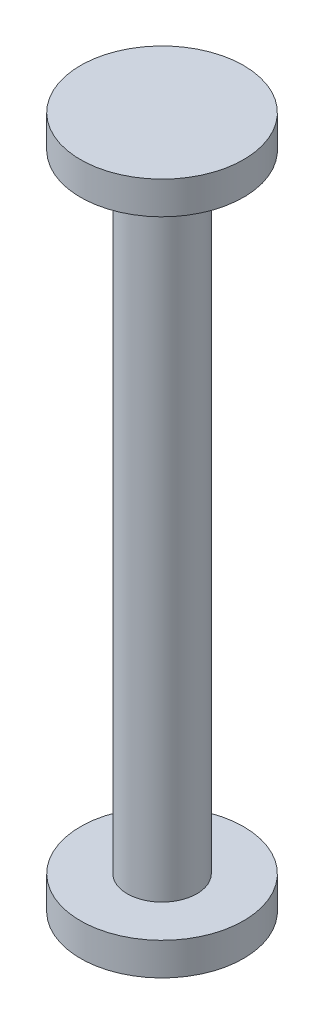
ISO-10303-21;
HEADER;
FILE_DESCRIPTION(('STEP AP214'),'2;1');
FILE_NAME('part.step','',(''),(''),'','','');
FILE_SCHEMA(('AUTOMOTIVE_DESIGN { 1 0 10303 214 1 1 1 1 }'));
ENDSEC;
DATA;
#1=APPLICATION_CONTEXT('core data for automotive mechanical design processes');
#2=APPLICATION_PROTOCOL_DEFINITION('international standard','automotive_design',2000,#1);
#3=PRODUCT_CONTEXT('',#1,'mechanical');
#4=PRODUCT('Part','Part','',(#3));
#5=PRODUCT_RELATED_PRODUCT_CATEGORY('part','',(#4));
#6=PRODUCT_DEFINITION_FORMATION('','',#4);
#7=PRODUCT_DEFINITION_CONTEXT('part definition',#1,'design');
#8=PRODUCT_DEFINITION('design','',#6,#7);
#9=PRODUCT_DEFINITION_SHAPE('','',#8);
#10=(LENGTH_UNIT() NAMED_UNIT(*) SI_UNIT(.MILLI.,.METRE.));
#11=(NAMED_UNIT(*) PLANE_ANGLE_UNIT() SI_UNIT($,.RADIAN.));
#12=(NAMED_UNIT(*) SI_UNIT($,.STERADIAN.) SOLID_ANGLE_UNIT());
#13=UNCERTAINTY_MEASURE_WITH_UNIT(LENGTH_MEASURE(1.E-05),#10,'distance_accuracy_value','');
#14=(GEOMETRIC_REPRESENTATION_CONTEXT(3) GLOBAL_UNCERTAINTY_ASSIGNED_CONTEXT((#13)) GLOBAL_UNIT_ASSIGNED_CONTEXT((#10,
#11,#12)) REPRESENTATION_CONTEXT('',''));
#15=CARTESIAN_POINT('',(0.,0.,0.));
#16=DIRECTION('',(0.,0.,1.));
#17=DIRECTION('',(1.,0.,0.));
#18=AXIS2_PLACEMENT_3D('',#15,#16,#17);
#19=CARTESIAN_POINT('',(0.,3.81,0.));
#20=DIRECTION('',(0.,-1.,0.));
#21=DIRECTION('',(0.,0.,-1.));
#22=AXIS2_PLACEMENT_3D('',#19,#20,#21);
#23=CYLINDRICAL_SURFACE('',#22,9.525);
#24=CARTESIAN_POINT('',(0.,3.81,0.));
#25=DIRECTION('',(0.,1.,0.));
#26=DIRECTION('',(0.,0.,1.));
#27=AXIS2_PLACEMENT_3D('',#24,#25,#26);
#28=CIRCLE('',#27,9.525);
#29=CARTESIAN_POINT('',(0.,3.81,-9.525));
#30=VERTEX_POINT('',#29);
#31=EDGE_CURVE('E46',#30,#30,#28,.T.);
#32=CARTESIAN_POINT('',(0.,0.,0.));
#33=DIRECTION('',(0.,1.,0.));
#34=DIRECTION('',(0.,0.,1.));
#35=AXIS2_PLACEMENT_3D('',#32,#33,#34);
#36=CIRCLE('',#35,9.525);
#37=CARTESIAN_POINT('',(0.,0.,-9.525));
#38=VERTEX_POINT('',#37);
#39=EDGE_CURVE('E45',#38,#38,#36,.T.);
#40=CARTESIAN_POINT('',(0.,3.81,-9.525));
#41=CARTESIAN_POINT('',(0.,3.7703125,-9.525));
#42=CARTESIAN_POINT('',(0.,3.730625,-9.525));
#43=CARTESIAN_POINT('',(0.,3.65125,-9.525));
#44=CARTESIAN_POINT('',(0.,3.6115625,-9.525));
#45=CARTESIAN_POINT('',(0.,3.5321875,-9.525));
#46=CARTESIAN_POINT('',(0.,3.4925,-9.525));
#47=CARTESIAN_POINT('',(0.,3.413125,-9.525));
#48=CARTESIAN_POINT('',(0.,3.3734375,-9.525));
#49=CARTESIAN_POINT('',(0.,3.2940625,-9.525));
#50=CARTESIAN_POINT('',(0.,3.254375,-9.525));
#51=CARTESIAN_POINT('',(0.,3.175,-9.525));
#52=CARTESIAN_POINT('',(0.,3.1353125,-9.525));
#53=CARTESIAN_POINT('',(0.,3.0559375,-9.525));
#54=CARTESIAN_POINT('',(0.,3.01625,-9.525));
#55=CARTESIAN_POINT('',(0.,2.936875,-9.525));
#56=CARTESIAN_POINT('',(0.,2.8971875,-9.525));
#57=CARTESIAN_POINT('',(0.,2.8178125,-9.525));
#58=CARTESIAN_POINT('',(0.,2.778125,-9.525));
#59=CARTESIAN_POINT('',(0.,2.69875,-9.525));
#60=CARTESIAN_POINT('',(0.,2.6590625,-9.525));
#61=CARTESIAN_POINT('',(0.,2.5796875,-9.525));
#62=CARTESIAN_POINT('',(0.,2.54,-9.525));
#63=CARTESIAN_POINT('',(0.,2.460625,-9.525));
#64=CARTESIAN_POINT('',(0.,2.4209375,-9.525));
#65=CARTESIAN_POINT('',(0.,2.3415625,-9.525));
#66=CARTESIAN_POINT('',(0.,2.301875,-9.525));
#67=CARTESIAN_POINT('',(0.,2.2225,-9.525));
#68=CARTESIAN_POINT('',(0.,2.1828125,-9.525));
#69=CARTESIAN_POINT('',(0.,2.1034375,-9.525));
#70=CARTESIAN_POINT('',(0.,2.06375,-9.525));
#71=CARTESIAN_POINT('',(0.,1.984375,-9.525));
#72=CARTESIAN_POINT('',(0.,1.9446875,-9.525));
#73=CARTESIAN_POINT('',(0.,1.8653125,-9.525));
#74=CARTESIAN_POINT('',(0.,1.825625,-9.525));
#75=CARTESIAN_POINT('',(0.,1.74625,-9.525));
#76=CARTESIAN_POINT('',(0.,1.7065625,-9.525));
#77=CARTESIAN_POINT('',(0.,1.6271875,-9.525));
#78=CARTESIAN_POINT('',(0.,1.5875,-9.525));
#79=CARTESIAN_POINT('',(0.,1.508125,-9.525));
#80=CARTESIAN_POINT('',(0.,1.4684375,-9.525));
#81=CARTESIAN_POINT('',(0.,1.3890625,-9.525));
#82=CARTESIAN_POINT('',(0.,1.349375,-9.525));
#83=CARTESIAN_POINT('',(0.,1.27,-9.525));
#84=CARTESIAN_POINT('',(0.,1.2303125,-9.525));
#85=CARTESIAN_POINT('',(0.,1.1509375,-9.525));
#86=CARTESIAN_POINT('',(0.,1.11125,-9.525));
#87=CARTESIAN_POINT('',(0.,1.031875,-9.525));
#88=CARTESIAN_POINT('',(0.,0.9921875,-9.525));
#89=CARTESIAN_POINT('',(0.,0.9128125,-9.525));
#90=CARTESIAN_POINT('',(0.,0.873125,-9.525));
#91=CARTESIAN_POINT('',(0.,0.79375,-9.525));
#92=CARTESIAN_POINT('',(0.,0.7540625,-9.525));
#93=CARTESIAN_POINT('',(0.,0.6746875,-9.525));
#94=CARTESIAN_POINT('',(0.,0.635,-9.525));
#95=CARTESIAN_POINT('',(0.,0.555625,-9.525));
#96=CARTESIAN_POINT('',(0.,0.5159375,-9.525));
#97=CARTESIAN_POINT('',(0.,0.4365625,-9.525));
#98=CARTESIAN_POINT('',(0.,0.396875,-9.525));
#99=CARTESIAN_POINT('',(0.,0.3175,-9.525));
#100=CARTESIAN_POINT('',(0.,0.2778125,-9.525));
#101=CARTESIAN_POINT('',(0.,0.1984375,-9.525));
#102=CARTESIAN_POINT('',(0.,0.15875,-9.525));
#103=CARTESIAN_POINT('',(0.,0.0793749999999999,-9.525));
#104=CARTESIAN_POINT('',(0.,0.0396874999999999,-9.525));
#105=CARTESIAN_POINT('',(0.,0.,-9.525));
#106=B_SPLINE_CURVE_WITH_KNOTS('',3,(#40,#41,#42,#43,#44,#45,#46,#47,#48,#49,#50,#51,#52,#53,
#54,#55,#56,#57,#58,#59,#60,#61,#62,#63,#64,#65,#66,#67,#68,#69,#70,#71,#72,#73,#74,#75,#76,#77,
#78,#79,#80,#81,#82,#83,#84,#85,#86,#87,#88,#89,#90,#91,#92,#93,#94,#95,#96,#97,#98,#99,#100,
#101,#102,#103,#104,#105),.UNSPECIFIED.,.F.,.F.,(4,2,2,2,2,2,2,2,2,2,2,2,2,2,2,2,2,2,2,2,2,2,2,
2,2,2,2,2,2,2,2,2,4),(0.,0.1190625,0.238125,0.3571875,0.47625,0.5953125,0.714375,0.8334375,
0.9525,1.0715625,1.190625,1.3096875,1.42875,1.5478125,1.666875,1.7859375,1.905,2.0240625,
2.143125,2.2621875,2.38125,2.5003125,2.619375,2.7384375,2.8575,2.9765625,3.095625,3.2146875,
3.33375,3.4528125,3.571875,3.6909375,3.81),.UNSPECIFIED.);
#107=EDGE_CURVE('BSEAM39',#30,#38,#106,.T.);
#108=ORIENTED_EDGE('',*,*,#31,.F.);
#109=ORIENTED_EDGE('',*,*,#39,.T.);
#110=ORIENTED_EDGE('',*,*,#107,.T.);
#111=ORIENTED_EDGE('',*,*,#107,.F.);
#112=EDGE_LOOP('',(#108,#110,#109,#111));
#113=FACE_BOUND('',#112,.T.);
#114=ADVANCED_FACE('F39',(#113),#23,.T.);
#115=CARTESIAN_POINT('',(0.,3.81,0.));
#116=DIRECTION('',(0.,1.,0.));
#117=DIRECTION('',(0.,0.,1.));
#118=AXIS2_PLACEMENT_3D('',#115,#116,#117);
#119=PLANE('',#118);
#120=CARTESIAN_POINT('',(0.,3.81,0.));
#121=DIRECTION('',(0.,1.,0.));
#122=DIRECTION('',(0.,0.,1.));
#123=AXIS2_PLACEMENT_3D('',#120,#121,#122);
#124=CIRCLE('',#123,4.064);
#125=CARTESIAN_POINT('',(0.,3.81,4.064));
#126=VERTEX_POINT('',#125);
#127=EDGE_CURVE('E10',#126,#126,#124,.T.);
#128=ORIENTED_EDGE('',*,*,#127,.F.);
#129=EDGE_LOOP('',(#128));
#130=FACE_BOUND('',#129,.T.);
#131=ORIENTED_EDGE('',*,*,#31,.T.);
#132=EDGE_LOOP('',(#131));
#133=FACE_BOUND('',#132,.T.);
#134=ADVANCED_FACE('F80',(#130,#133),#119,.T.);
#135=CARTESIAN_POINT('',(0.,0.,0.));
#136=DIRECTION('',(0.,1.,0.));
#137=DIRECTION('',(0.,0.,1.));
#138=AXIS2_PLACEMENT_3D('',#135,#136,#137);
#139=PLANE('',#138);
#140=ORIENTED_EDGE('',*,*,#39,.F.);
#141=EDGE_LOOP('',(#140));
#142=FACE_BOUND('',#141,.T.);
#143=ADVANCED_FACE('F88',(#142),#139,.F.);
#144=CARTESIAN_POINT('',(0.,76.962,0.));
#145=DIRECTION('',(0.,-1.,0.));
#146=DIRECTION('',(0.,0.,-1.));
#147=AXIS2_PLACEMENT_3D('',#144,#145,#146);
#148=CYLINDRICAL_SURFACE('',#147,4.064);
#149=CARTESIAN_POINT('',(0.,76.962,0.));
#150=DIRECTION('',(0.,1.,0.));
#151=DIRECTION('',(0.,0.,1.));
#152=AXIS2_PLACEMENT_3D('',#149,#150,#151);
#153=CIRCLE('',#152,4.064);
#154=CARTESIAN_POINT('',(0.,76.962,4.064));
#155=VERTEX_POINT('',#154);
#156=EDGE_CURVE('E55',#155,#155,#153,.T.);
#157=ORIENTED_EDGE('',*,*,#156,.F.);
#158=EDGE_LOOP('',(#157));
#159=FACE_BOUND('',#158,.T.);
#160=ORIENTED_EDGE('',*,*,#127,.T.);
#161=EDGE_LOOP('',(#160));
#162=FACE_BOUND('',#161,.T.);
#163=ADVANCED_FACE('F70',(#159,#162),#148,.T.);
#164=CARTESIAN_POINT('',(0.,80.772,0.));
#165=DIRECTION('',(0.,-1.,0.));
#166=DIRECTION('',(0.,0.,-1.));
#167=AXIS2_PLACEMENT_3D('',#164,#165,#166);
#168=CYLINDRICAL_SURFACE('',#167,9.525);
#169=CARTESIAN_POINT('',(0.,80.772,0.));
#170=DIRECTION('',(0.,1.,0.));
#171=DIRECTION('',(0.,0.,1.));
#172=AXIS2_PLACEMENT_3D('',#169,#170,#171);
#173=CIRCLE('',#172,9.525);
#174=CARTESIAN_POINT('',(0.,80.772,-9.525));
#175=VERTEX_POINT('',#174);
#176=EDGE_CURVE('E54',#175,#175,#173,.T.);
#177=CARTESIAN_POINT('',(0.,76.962,0.));
#178=DIRECTION('',(0.,1.,0.));
#179=DIRECTION('',(0.,0.,1.));
#180=AXIS2_PLACEMENT_3D('',#177,#178,#179);
#181=CIRCLE('',#180,9.525);
#182=CARTESIAN_POINT('',(0.,76.962,-9.525));
#183=VERTEX_POINT('',#182);
#184=EDGE_CURVE('E57',#183,#183,#181,.T.);
#185=CARTESIAN_POINT('',(0.,80.772,-9.525));
#186=CARTESIAN_POINT('',(0.,80.7323125,-9.525));
#187=CARTESIAN_POINT('',(0.,80.692625,-9.525));
#188=CARTESIAN_POINT('',(0.,80.61325,-9.525));
#189=CARTESIAN_POINT('',(0.,80.5735625,-9.525));
#190=CARTESIAN_POINT('',(0.,80.4941875,-9.525));
#191=CARTESIAN_POINT('',(0.,80.4545,-9.525));
#192=CARTESIAN_POINT('',(0.,80.375125,-9.525));
#193=CARTESIAN_POINT('',(0.,80.3354375,-9.525));
#194=CARTESIAN_POINT('',(0.,80.2560625,-9.525));
#195=CARTESIAN_POINT('',(0.,80.216375,-9.525));
#196=CARTESIAN_POINT('',(0.,80.137,-9.525));
#197=CARTESIAN_POINT('',(0.,80.0973125,-9.525));
#198=CARTESIAN_POINT('',(0.,80.0179375,-9.525));
#199=CARTESIAN_POINT('',(0.,79.97825,-9.525));
#200=CARTESIAN_POINT('',(0.,79.898875,-9.525));
#201=CARTESIAN_POINT('',(0.,79.8591875,-9.525));
#202=CARTESIAN_POINT('',(0.,79.7798125,-9.525));
#203=CARTESIAN_POINT('',(0.,79.740125,-9.525));
#204=CARTESIAN_POINT('',(0.,79.66075,-9.525));
#205=CARTESIAN_POINT('',(0.,79.6210625,-9.525));
#206=CARTESIAN_POINT('',(0.,79.5416875,-9.525));
#207=CARTESIAN_POINT('',(0.,79.502,-9.525));
#208=CARTESIAN_POINT('',(0.,79.422625,-9.525));
#209=CARTESIAN_POINT('',(0.,79.3829375,-9.525));
#210=CARTESIAN_POINT('',(0.,79.3035625,-9.525));
#211=CARTESIAN_POINT('',(0.,79.263875,-9.525));
#212=CARTESIAN_POINT('',(0.,79.1845,-9.525));
#213=CARTESIAN_POINT('',(0.,79.1448125,-9.525));
#214=CARTESIAN_POINT('',(0.,79.0654375,-9.525));
#215=CARTESIAN_POINT('',(0.,79.02575,-9.525));
#216=CARTESIAN_POINT('',(0.,78.946375,-9.525));
#217=CARTESIAN_POINT('',(0.,78.9066875,-9.525));
#218=CARTESIAN_POINT('',(0.,78.8273125,-9.525));
#219=CARTESIAN_POINT('',(0.,78.787625,-9.525));
#220=CARTESIAN_POINT('',(0.,78.70825,-9.525));
#221=CARTESIAN_POINT('',(0.,78.6685625,-9.525));
#222=CARTESIAN_POINT('',(0.,78.5891875,-9.525));
#223=CARTESIAN_POINT('',(0.,78.5495,-9.525));
#224=CARTESIAN_POINT('',(0.,78.470125,-9.525));
#225=CARTESIAN_POINT('',(0.,78.4304375,-9.525));
#226=CARTESIAN_POINT('',(0.,78.3510625,-9.525));
#227=CARTESIAN_POINT('',(0.,78.311375,-9.525));
#228=CARTESIAN_POINT('',(0.,78.232,-9.525));
#229=CARTESIAN_POINT('',(0.,78.1923125,-9.525));
#230=CARTESIAN_POINT('',(0.,78.1129375,-9.525));
#231=CARTESIAN_POINT('',(0.,78.07325,-9.525));
#232=CARTESIAN_POINT('',(0.,77.993875,-9.525));
#233=CARTESIAN_POINT('',(0.,77.9541875,-9.525));
#234=CARTESIAN_POINT('',(0.,77.8748125,-9.525));
#235=CARTESIAN_POINT('',(0.,77.835125,-9.525));
#236=CARTESIAN_POINT('',(0.,77.75575,-9.525));
#237=CARTESIAN_POINT('',(0.,77.7160625,-9.525));
#238=CARTESIAN_POINT('',(0.,77.6366875,-9.525));
#239=CARTESIAN_POINT('',(0.,77.597,-9.525));
#240=CARTESIAN_POINT('',(0.,77.517625,-9.525));
#241=CARTESIAN_POINT('',(0.,77.4779375,-9.525));
#242=CARTESIAN_POINT('',(0.,77.3985625,-9.525));
#243=CARTESIAN_POINT('',(0.,77.358875,-9.525));
#244=CARTESIAN_POINT('',(0.,77.2795,-9.525));
#245=CARTESIAN_POINT('',(0.,77.2398125,-9.525));
#246=CARTESIAN_POINT('',(0.,77.1604375,-9.525));
#247=CARTESIAN_POINT('',(0.,77.12075,-9.525));
#248=CARTESIAN_POINT('',(0.,77.041375,-9.525));
#249=CARTESIAN_POINT('',(0.,77.0016875,-9.525));
#250=CARTESIAN_POINT('',(0.,76.962,-9.525));
#251=B_SPLINE_CURVE_WITH_KNOTS('',3,(#185,#186,#187,#188,#189,#190,#191,#192,#193,#194,#195,
#196,#197,#198,#199,#200,#201,#202,#203,#204,#205,#206,#207,#208,#209,#210,#211,#212,#213,#214,
#215,#216,#217,#218,#219,#220,#221,#222,#223,#224,#225,#226,#227,#228,#229,#230,#231,#232,#233,
#234,#235,#236,#237,#238,#239,#240,#241,#242,#243,#244,#245,#246,#247,#248,#249,#250),
.UNSPECIFIED.,.F.,.F.,(4,2,2,2,2,2,2,2,2,2,2,2,2,2,2,2,2,2,2,2,2,2,2,2,2,2,2,2,2,2,2,2,4),(0.,
0.119062500000003,0.238125000000006,0.357187500000009,0.476250000000011,0.5953125,
0.714375000000003,0.833437500000006,0.952500000000009,1.07156250000001,1.190625,1.3096875,
1.42875000000001,1.54781250000001,1.666875,1.7859375,1.905,2.02406250000001,2.14312500000001,
2.2621875,2.38125,2.5003125,2.61937500000001,2.7384375,2.8575,2.9765625,3.095625,
3.21468750000001,3.33375,3.4528125,3.571875,3.6909375,3.80999999999999),.UNSPECIFIED.);
#252=EDGE_CURVE('BSEAM63',#175,#183,#251,.T.);
#253=ORIENTED_EDGE('',*,*,#176,.F.);
#254=ORIENTED_EDGE('',*,*,#184,.T.);
#255=ORIENTED_EDGE('',*,*,#252,.T.);
#256=ORIENTED_EDGE('',*,*,#252,.F.);
#257=EDGE_LOOP('',(#253,#255,#254,#256));
#258=FACE_BOUND('',#257,.T.);
#259=ADVANCED_FACE('F63',(#258),#168,.T.);
#260=CARTESIAN_POINT('',(0.,80.772,0.));
#261=DIRECTION('',(0.,1.,0.));
#262=DIRECTION('',(0.,0.,1.));
#263=AXIS2_PLACEMENT_3D('',#260,#261,#262);
#264=PLANE('',#263);
#265=ORIENTED_EDGE('',*,*,#176,.T.);
#266=EDGE_LOOP('',(#265));
#267=FACE_BOUND('',#266,.T.);
#268=ADVANCED_FACE('F62',(#267),#264,.T.);
#269=CARTESIAN_POINT('',(0.,76.962,0.));
#270=DIRECTION('',(0.,1.,0.));
#271=DIRECTION('',(0.,0.,1.));
#272=AXIS2_PLACEMENT_3D('',#269,#270,#271);
#273=PLANE('',#272);
#274=ORIENTED_EDGE('',*,*,#156,.T.);
#275=EDGE_LOOP('',(#274));
#276=FACE_BOUND('',#275,.T.);
#277=ORIENTED_EDGE('',*,*,#184,.F.);
#278=EDGE_LOOP('',(#277));
#279=FACE_BOUND('',#278,.T.);
#280=ADVANCED_FACE('F72',(#276,#279),#273,.F.);
#281=CLOSED_SHELL('',(#114,#134,#143,#163,#259,#268,#280));
#282=MANIFOLD_SOLID_BREP('B2',#281);
#283=ADVANCED_BREP_SHAPE_REPRESENTATION('',(#18,#282),#14);
#284=SHAPE_DEFINITION_REPRESENTATION(#9,#283);
ENDSEC;
END-ISO-10303-21;
